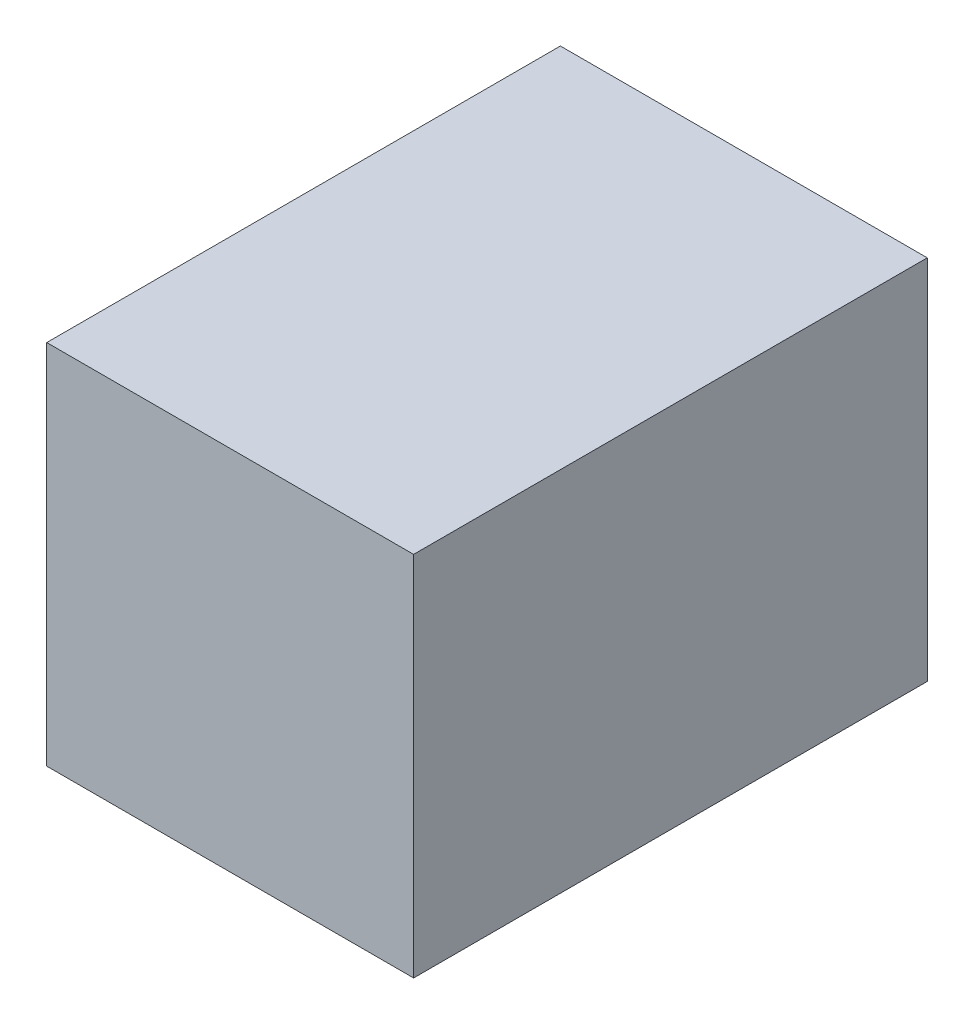
ISO-10303-21;
HEADER;
FILE_DESCRIPTION(('STEP AP214'),'2;1');
FILE_NAME('part.step','',(''),(''),'','','');
FILE_SCHEMA(('AUTOMOTIVE_DESIGN { 1 0 10303 214 1 1 1 1 }'));
ENDSEC;
DATA;
#1=APPLICATION_CONTEXT('core data for automotive mechanical design processes');
#2=APPLICATION_PROTOCOL_DEFINITION('international standard','automotive_design',2000,#1);
#3=PRODUCT_CONTEXT('',#1,'mechanical');
#4=PRODUCT('Part','Part','',(#3));
#5=PRODUCT_RELATED_PRODUCT_CATEGORY('part','',(#4));
#6=PRODUCT_DEFINITION_FORMATION('','',#4);
#7=PRODUCT_DEFINITION_CONTEXT('part definition',#1,'design');
#8=PRODUCT_DEFINITION('design','',#6,#7);
#9=PRODUCT_DEFINITION_SHAPE('','',#8);
#10=(LENGTH_UNIT() NAMED_UNIT(*) SI_UNIT(.MILLI.,.METRE.));
#11=(NAMED_UNIT(*) PLANE_ANGLE_UNIT() SI_UNIT($,.RADIAN.));
#12=(NAMED_UNIT(*) SI_UNIT($,.STERADIAN.) SOLID_ANGLE_UNIT());
#13=UNCERTAINTY_MEASURE_WITH_UNIT(LENGTH_MEASURE(1.E-05),#10,'distance_accuracy_value','');
#14=(GEOMETRIC_REPRESENTATION_CONTEXT(3) GLOBAL_UNCERTAINTY_ASSIGNED_CONTEXT((#13)) GLOBAL_UNIT_ASSIGNED_CONTEXT((#10,
#11,#12)) REPRESENTATION_CONTEXT('',''));
#15=CARTESIAN_POINT('',(0.,0.,0.));
#16=DIRECTION('',(0.,0.,1.));
#17=DIRECTION('',(1.,0.,0.));
#18=AXIS2_PLACEMENT_3D('',#15,#16,#17);
#19=CARTESIAN_POINT('',(60.,900.,-780.));
#20=DIRECTION('',(-1.,0.,0.));
#21=DIRECTION('',(0.,0.,1.));
#22=AXIS2_PLACEMENT_3D('',#19,#20,#21);
#23=PLANE('',#22);
#24=DIRECTION('',(0.,-1.,0.));
#25=VECTOR('',#24,1.);
#26=CARTESIAN_POINT('',(60.,900.,-640.));
#27=LINE('',#26,#25);
#28=CARTESIAN_POINT('',(60.,1000.,-640.));
#29=VERTEX_POINT('',#28);
#30=CARTESIAN_POINT('',(60.,900.,-640.));
#31=VERTEX_POINT('',#30);
#32=EDGE_CURVE('E103',#29,#31,#27,.T.);
#33=ORIENTED_EDGE('',*,*,#32,.F.);
#34=DIRECTION('',(0.,0.,1.));
#35=VECTOR('',#34,1.);
#36=CARTESIAN_POINT('',(60.,1000.,-780.));
#37=LINE('',#36,#35);
#38=CARTESIAN_POINT('',(60.,1000.,-780.));
#39=VERTEX_POINT('',#38);
#40=EDGE_CURVE('E11',#39,#29,#37,.T.);
#41=ORIENTED_EDGE('',*,*,#40,.F.);
#42=DIRECTION('',(0.,-1.,0.));
#43=VECTOR('',#42,1.);
#44=CARTESIAN_POINT('',(60.,900.,-780.));
#45=LINE('',#44,#43);
#46=CARTESIAN_POINT('',(60.,900.,-780.));
#47=VERTEX_POINT('',#46);
#48=EDGE_CURVE('E97',#39,#47,#45,.T.);
#49=ORIENTED_EDGE('',*,*,#48,.T.);
#50=DIRECTION('',(0.,0.,1.));
#51=VECTOR('',#50,1.);
#52=CARTESIAN_POINT('',(60.,900.,-780.));
#53=LINE('',#52,#51);
#54=EDGE_CURVE('E42',#47,#31,#53,.T.);
#55=ORIENTED_EDGE('',*,*,#54,.T.);
#56=EDGE_LOOP('',(#33,#41,#49,#55));
#57=FACE_BOUND('',#56,.T.);
#58=ADVANCED_FACE('F39',(#57),#23,.T.);
#59=CARTESIAN_POINT('',(60.,1000.,-780.));
#60=DIRECTION('',(0.,1.,0.));
#61=DIRECTION('',(0.,0.,1.));
#62=AXIS2_PLACEMENT_3D('',#59,#60,#61);
#63=PLANE('',#62);
#64=DIRECTION('',(-1.,0.,0.));
#65=VECTOR('',#64,1.);
#66=CARTESIAN_POINT('',(60.,1000.,-640.));
#67=LINE('',#66,#65);
#68=CARTESIAN_POINT('',(160.,1000.,-640.));
#69=VERTEX_POINT('',#68);
#70=EDGE_CURVE('E99',#69,#29,#67,.T.);
#71=ORIENTED_EDGE('',*,*,#70,.F.);
#72=DIRECTION('',(0.,0.,1.));
#73=VECTOR('',#72,1.);
#74=CARTESIAN_POINT('',(160.,1000.,-780.));
#75=LINE('',#74,#73);
#76=CARTESIAN_POINT('',(160.,1000.,-780.));
#77=VERTEX_POINT('',#76);
#78=EDGE_CURVE('E48',#77,#69,#75,.T.);
#79=ORIENTED_EDGE('',*,*,#78,.F.);
#80=DIRECTION('',(-1.,0.,0.));
#81=VECTOR('',#80,1.);
#82=CARTESIAN_POINT('',(60.,1000.,-780.));
#83=LINE('',#82,#81);
#84=EDGE_CURVE('E94',#77,#39,#83,.T.);
#85=ORIENTED_EDGE('',*,*,#84,.T.);
#86=ORIENTED_EDGE('',*,*,#40,.T.);
#87=EDGE_LOOP('',(#71,#79,#85,#86));
#88=FACE_BOUND('',#87,.T.);
#89=ADVANCED_FACE('F113',(#88),#63,.T.);
#90=CARTESIAN_POINT('',(160.,900.,-780.));
#91=DIRECTION('',(1.,0.,0.));
#92=DIRECTION('',(0.,0.,-1.));
#93=AXIS2_PLACEMENT_3D('',#90,#91,#92);
#94=PLANE('',#93);
#95=DIRECTION('',(0.,1.,0.));
#96=VECTOR('',#95,1.);
#97=CARTESIAN_POINT('',(160.,900.,-640.));
#98=LINE('',#97,#96);
#99=CARTESIAN_POINT('',(160.,900.,-640.));
#100=VERTEX_POINT('',#99);
#101=EDGE_CURVE('E89',#100,#69,#98,.T.);
#102=ORIENTED_EDGE('',*,*,#101,.F.);
#103=DIRECTION('',(0.,0.,1.));
#104=VECTOR('',#103,1.);
#105=CARTESIAN_POINT('',(160.,900.,-780.));
#106=LINE('',#105,#104);
#107=CARTESIAN_POINT('',(160.,900.,-780.));
#108=VERTEX_POINT('',#107);
#109=EDGE_CURVE('E84',#108,#100,#106,.T.);
#110=ORIENTED_EDGE('',*,*,#109,.F.);
#111=DIRECTION('',(0.,1.,0.));
#112=VECTOR('',#111,1.);
#113=CARTESIAN_POINT('',(160.,900.,-780.));
#114=LINE('',#113,#112);
#115=EDGE_CURVE('E87',#108,#77,#114,.T.);
#116=ORIENTED_EDGE('',*,*,#115,.T.);
#117=ORIENTED_EDGE('',*,*,#78,.T.);
#118=EDGE_LOOP('',(#102,#110,#116,#117));
#119=FACE_BOUND('',#118,.T.);
#120=ADVANCED_FACE('F86',(#119),#94,.T.);
#121=CARTESIAN_POINT('',(60.,900.,-780.));
#122=DIRECTION('',(0.,-1.,0.));
#123=DIRECTION('',(0.,0.,-1.));
#124=AXIS2_PLACEMENT_3D('',#121,#122,#123);
#125=PLANE('',#124);
#126=DIRECTION('',(1.,0.,0.));
#127=VECTOR('',#126,1.);
#128=CARTESIAN_POINT('',(60.,900.,-640.));
#129=LINE('',#128,#127);
#130=EDGE_CURVE('E106',#31,#100,#129,.T.);
#131=ORIENTED_EDGE('',*,*,#130,.F.);
#132=ORIENTED_EDGE('',*,*,#54,.F.);
#133=DIRECTION('',(1.,0.,0.));
#134=VECTOR('',#133,1.);
#135=CARTESIAN_POINT('',(60.,900.,-780.));
#136=LINE('',#135,#134);
#137=EDGE_CURVE('E93',#47,#108,#136,.T.);
#138=ORIENTED_EDGE('',*,*,#137,.T.);
#139=ORIENTED_EDGE('',*,*,#109,.T.);
#140=EDGE_LOOP('',(#131,#132,#138,#139));
#141=FACE_BOUND('',#140,.T.);
#142=ADVANCED_FACE('F96',(#141),#125,.T.);
#143=CARTESIAN_POINT('',(0.,0.,-780.));
#144=DIRECTION('',(0.,0.,-1.));
#145=DIRECTION('',(-1.,0.,0.));
#146=AXIS2_PLACEMENT_3D('',#143,#144,#145);
#147=PLANE('',#146);
#148=ORIENTED_EDGE('',*,*,#48,.F.);
#149=ORIENTED_EDGE('',*,*,#84,.F.);
#150=ORIENTED_EDGE('',*,*,#115,.F.);
#151=ORIENTED_EDGE('',*,*,#137,.F.);
#152=EDGE_LOOP('',(#148,#149,#150,#151));
#153=FACE_BOUND('',#152,.T.);
#154=ADVANCED_FACE('F92',(#153),#147,.T.);
#155=CARTESIAN_POINT('',(0.,0.,-640.));
#156=DIRECTION('',(0.,0.,-1.));
#157=DIRECTION('',(-1.,0.,0.));
#158=AXIS2_PLACEMENT_3D('',#155,#156,#157);
#159=PLANE('',#158);
#160=ORIENTED_EDGE('',*,*,#32,.T.);
#161=ORIENTED_EDGE('',*,*,#130,.T.);
#162=ORIENTED_EDGE('',*,*,#101,.T.);
#163=ORIENTED_EDGE('',*,*,#70,.T.);
#164=EDGE_LOOP('',(#160,#161,#162,#163));
#165=FACE_BOUND('',#164,.T.);
#166=ADVANCED_FACE('F112',(#165),#159,.F.);
#167=CLOSED_SHELL('',(#58,#89,#120,#142,#154,#166));
#168=MANIFOLD_SOLID_BREP('B2',#167);
#169=ADVANCED_BREP_SHAPE_REPRESENTATION('',(#18,#168),#14);
#170=SHAPE_DEFINITION_REPRESENTATION(#9,#169);
ENDSEC;
END-ISO-10303-21;
